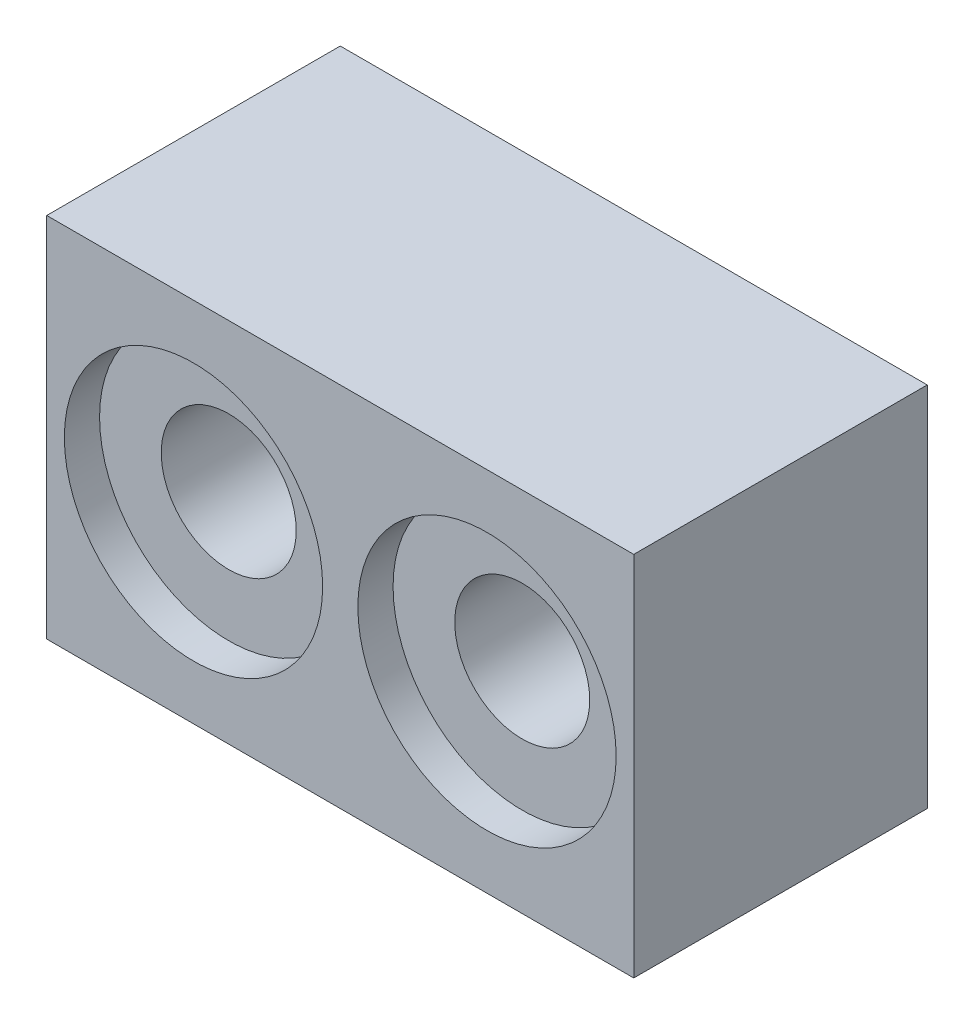
ISO-10303-21;
HEADER;
FILE_DESCRIPTION(('STEP AP214'),'2;1');
FILE_NAME('part.step','',(''),(''),'','','');
FILE_SCHEMA(('AUTOMOTIVE_DESIGN { 1 0 10303 214 1 1 1 1 }'));
ENDSEC;
DATA;
#1=APPLICATION_CONTEXT('core data for automotive mechanical design processes');
#2=APPLICATION_PROTOCOL_DEFINITION('international standard','automotive_design',2000,#1);
#3=PRODUCT_CONTEXT('',#1,'mechanical');
#4=PRODUCT('Part','Part','',(#3));
#5=PRODUCT_RELATED_PRODUCT_CATEGORY('part','',(#4));
#6=PRODUCT_DEFINITION_FORMATION('','',#4);
#7=PRODUCT_DEFINITION_CONTEXT('part definition',#1,'design');
#8=PRODUCT_DEFINITION('design','',#6,#7);
#9=PRODUCT_DEFINITION_SHAPE('','',#8);
#10=(LENGTH_UNIT() NAMED_UNIT(*) SI_UNIT(.MILLI.,.METRE.));
#11=(NAMED_UNIT(*) PLANE_ANGLE_UNIT() SI_UNIT($,.RADIAN.));
#12=(NAMED_UNIT(*) SI_UNIT($,.STERADIAN.) SOLID_ANGLE_UNIT());
#13=UNCERTAINTY_MEASURE_WITH_UNIT(LENGTH_MEASURE(1.E-05),#10,'distance_accuracy_value','');
#14=(GEOMETRIC_REPRESENTATION_CONTEXT(3) GLOBAL_UNCERTAINTY_ASSIGNED_CONTEXT((#13)) GLOBAL_UNIT_ASSIGNED_CONTEXT((#10,
#11,#12)) REPRESENTATION_CONTEXT('',''));
#15=CARTESIAN_POINT('',(0.,0.,0.));
#16=DIRECTION('',(0.,0.,1.));
#17=DIRECTION('',(1.,0.,0.));
#18=AXIS2_PLACEMENT_3D('',#15,#16,#17);
#19=CARTESIAN_POINT('',(0.,0.,6.35));
#20=DIRECTION('',(1.,0.,0.));
#21=DIRECTION('',(0.,0.,-1.));
#22=AXIS2_PLACEMENT_3D('',#19,#20,#21);
#23=PLANE('',#22);
#24=DIRECTION('',(0.,-1.,0.));
#25=VECTOR('',#24,1.);
#26=CARTESIAN_POINT('',(0.,0.,0.));
#27=LINE('',#26,#25);
#28=CARTESIAN_POINT('',(0.,7.9375,0.));
#29=VERTEX_POINT('',#28);
#30=CARTESIAN_POINT('',(0.,0.,0.));
#31=VERTEX_POINT('',#30);
#32=EDGE_CURVE('E96',#29,#31,#27,.T.);
#33=ORIENTED_EDGE('',*,*,#32,.T.);
#34=DIRECTION('',(0.,0.,-1.));
#35=VECTOR('',#34,1.);
#36=CARTESIAN_POINT('',(0.,0.,6.35));
#37=LINE('',#36,#35);
#38=CARTESIAN_POINT('',(0.,0.,6.35));
#39=VERTEX_POINT('',#38);
#40=EDGE_CURVE('E11',#39,#31,#37,.T.);
#41=ORIENTED_EDGE('',*,*,#40,.F.);
#42=DIRECTION('',(0.,-1.,0.));
#43=VECTOR('',#42,1.);
#44=CARTESIAN_POINT('',(0.,0.,6.35));
#45=LINE('',#44,#43);
#46=CARTESIAN_POINT('',(0.,7.9375,6.35));
#47=VERTEX_POINT('',#46);
#48=EDGE_CURVE('E84',#47,#39,#45,.T.);
#49=ORIENTED_EDGE('',*,*,#48,.F.);
#50=DIRECTION('',(0.,0.,-1.));
#51=VECTOR('',#50,1.);
#52=CARTESIAN_POINT('',(0.,7.9375,6.35));
#53=LINE('',#52,#51);
#54=EDGE_CURVE('E92',#47,#29,#53,.T.);
#55=ORIENTED_EDGE('',*,*,#54,.T.);
#56=EDGE_LOOP('',(#33,#41,#49,#55));
#57=FACE_BOUND('',#56,.T.);
#58=ADVANCED_FACE('F33',(#57),#23,.F.);
#59=CARTESIAN_POINT('',(0.,0.,6.35));
#60=DIRECTION('',(0.,1.,0.));
#61=DIRECTION('',(0.,0.,1.));
#62=AXIS2_PLACEMENT_3D('',#59,#60,#61);
#63=PLANE('',#62);
#64=DIRECTION('',(1.,0.,0.));
#65=VECTOR('',#64,1.);
#66=CARTESIAN_POINT('',(0.,0.,0.));
#67=LINE('',#66,#65);
#68=CARTESIAN_POINT('',(12.7,0.,0.));
#69=VERTEX_POINT('',#68);
#70=EDGE_CURVE('E88',#31,#69,#67,.T.);
#71=ORIENTED_EDGE('',*,*,#70,.T.);
#72=DIRECTION('',(0.,0.,-1.));
#73=VECTOR('',#72,1.);
#74=CARTESIAN_POINT('',(12.7,0.,6.35));
#75=LINE('',#74,#73);
#76=CARTESIAN_POINT('',(12.7,0.,6.35));
#77=VERTEX_POINT('',#76);
#78=EDGE_CURVE('E41',#77,#69,#75,.T.);
#79=ORIENTED_EDGE('',*,*,#78,.F.);
#80=DIRECTION('',(1.,0.,0.));
#81=VECTOR('',#80,1.);
#82=CARTESIAN_POINT('',(0.,0.,6.35));
#83=LINE('',#82,#81);
#84=EDGE_CURVE('E79',#39,#77,#83,.T.);
#85=ORIENTED_EDGE('',*,*,#84,.F.);
#86=ORIENTED_EDGE('',*,*,#40,.T.);
#87=EDGE_LOOP('',(#71,#79,#85,#86));
#88=FACE_BOUND('',#87,.T.);
#89=ADVANCED_FACE('F87',(#88),#63,.F.);
#90=CARTESIAN_POINT('',(12.7,0.,6.35));
#91=DIRECTION('',(-1.,0.,0.));
#92=DIRECTION('',(0.,0.,1.));
#93=AXIS2_PLACEMENT_3D('',#90,#91,#92);
#94=PLANE('',#93);
#95=DIRECTION('',(0.,1.,0.));
#96=VECTOR('',#95,1.);
#97=CARTESIAN_POINT('',(12.7,0.,0.));
#98=LINE('',#97,#96);
#99=CARTESIAN_POINT('',(12.7,7.9375,0.));
#100=VERTEX_POINT('',#99);
#101=EDGE_CURVE('E66',#69,#100,#98,.T.);
#102=ORIENTED_EDGE('',*,*,#101,.T.);
#103=DIRECTION('',(0.,0.,-1.));
#104=VECTOR('',#103,1.);
#105=CARTESIAN_POINT('',(12.7,7.9375,6.35));
#106=LINE('',#105,#104);
#107=CARTESIAN_POINT('',(12.7,7.9375,6.35));
#108=VERTEX_POINT('',#107);
#109=EDGE_CURVE('E89',#108,#100,#106,.T.);
#110=ORIENTED_EDGE('',*,*,#109,.F.);
#111=DIRECTION('',(0.,1.,0.));
#112=VECTOR('',#111,1.);
#113=CARTESIAN_POINT('',(12.7,0.,6.35));
#114=LINE('',#113,#112);
#115=EDGE_CURVE('E82',#77,#108,#114,.T.);
#116=ORIENTED_EDGE('',*,*,#115,.F.);
#117=ORIENTED_EDGE('',*,*,#78,.T.);
#118=EDGE_LOOP('',(#102,#110,#116,#117));
#119=FACE_BOUND('',#118,.T.);
#120=ADVANCED_FACE('F90',(#119),#94,.F.);
#121=CARTESIAN_POINT('',(0.,7.9375,6.35));
#122=DIRECTION('',(0.,-1.,0.));
#123=DIRECTION('',(0.,0.,-1.));
#124=AXIS2_PLACEMENT_3D('',#121,#122,#123);
#125=PLANE('',#124);
#126=DIRECTION('',(-1.,0.,0.));
#127=VECTOR('',#126,1.);
#128=CARTESIAN_POINT('',(0.,7.9375,0.));
#129=LINE('',#128,#127);
#130=EDGE_CURVE('E72',#100,#29,#129,.T.);
#131=ORIENTED_EDGE('',*,*,#130,.T.);
#132=ORIENTED_EDGE('',*,*,#54,.F.);
#133=DIRECTION('',(-1.,0.,0.));
#134=VECTOR('',#133,1.);
#135=CARTESIAN_POINT('',(0.,7.9375,6.35));
#136=LINE('',#135,#134);
#137=EDGE_CURVE('E49',#108,#47,#136,.T.);
#138=ORIENTED_EDGE('',*,*,#137,.F.);
#139=ORIENTED_EDGE('',*,*,#109,.T.);
#140=EDGE_LOOP('',(#131,#132,#138,#139));
#141=FACE_BOUND('',#140,.T.);
#142=ADVANCED_FACE('F104',(#141),#125,.F.);
#143=CARTESIAN_POINT('',(0.,0.,6.35));
#144=DIRECTION('',(0.,0.,-1.));
#145=DIRECTION('',(-1.,0.,0.));
#146=AXIS2_PLACEMENT_3D('',#143,#144,#145);
#147=PLANE('',#146);
#148=CARTESIAN_POINT('',(9.525,3.96875,6.35));
#149=DIRECTION('',(0.,0.,1.));
#150=DIRECTION('',(1.,0.,0.));
#151=AXIS2_PLACEMENT_3D('',#148,#149,#150);
#152=CIRCLE('',#151,2.794);
#153=CARTESIAN_POINT('',(12.319,3.96875,6.35));
#154=VERTEX_POINT('',#153);
#155=EDGE_CURVE('E116',#154,#154,#152,.T.);
#156=ORIENTED_EDGE('',*,*,#155,.F.);
#157=EDGE_LOOP('',(#156));
#158=FACE_BOUND('',#157,.T.);
#159=CARTESIAN_POINT('',(3.175,3.96875,6.35));
#160=DIRECTION('',(0.,0.,1.));
#161=DIRECTION('',(1.,0.,0.));
#162=AXIS2_PLACEMENT_3D('',#159,#160,#161);
#163=CIRCLE('',#162,2.794);
#164=CARTESIAN_POINT('',(5.969,3.96875,6.35));
#165=VERTEX_POINT('',#164);
#166=EDGE_CURVE('E110',#165,#165,#163,.T.);
#167=ORIENTED_EDGE('',*,*,#166,.F.);
#168=EDGE_LOOP('',(#167));
#169=FACE_BOUND('',#168,.T.);
#170=ORIENTED_EDGE('',*,*,#48,.T.);
#171=ORIENTED_EDGE('',*,*,#84,.T.);
#172=ORIENTED_EDGE('',*,*,#115,.T.);
#173=ORIENTED_EDGE('',*,*,#137,.T.);
#174=EDGE_LOOP('',(#170,#171,#172,#173));
#175=FACE_BOUND('',#174,.T.);
#176=ADVANCED_FACE('F80',(#158,#169,#175),#147,.F.);
#177=CARTESIAN_POINT('',(0.,0.,0.));
#178=DIRECTION('',(0.,0.,-1.));
#179=DIRECTION('',(-1.,0.,0.));
#180=AXIS2_PLACEMENT_3D('',#177,#178,#179);
#181=PLANE('',#180);
#182=CARTESIAN_POINT('',(9.525,3.96875,0.));
#183=DIRECTION('',(0.,0.,1.));
#184=DIRECTION('',(1.,0.,0.));
#185=AXIS2_PLACEMENT_3D('',#182,#183,#184);
#186=CIRCLE('',#185,1.4605);
#187=CARTESIAN_POINT('',(10.9855,3.96875,0.));
#188=VERTEX_POINT('',#187);
#189=EDGE_CURVE('E125',#188,#188,#186,.T.);
#190=ORIENTED_EDGE('',*,*,#189,.T.);
#191=EDGE_LOOP('',(#190));
#192=FACE_BOUND('',#191,.T.);
#193=CARTESIAN_POINT('',(3.175,3.96875,0.));
#194=DIRECTION('',(0.,0.,1.));
#195=DIRECTION('',(1.,0.,0.));
#196=AXIS2_PLACEMENT_3D('',#193,#194,#195);
#197=CIRCLE('',#196,1.4605);
#198=CARTESIAN_POINT('',(4.6355,3.96875,0.));
#199=VERTEX_POINT('',#198);
#200=EDGE_CURVE('E119',#199,#199,#197,.T.);
#201=ORIENTED_EDGE('',*,*,#200,.T.);
#202=EDGE_LOOP('',(#201));
#203=FACE_BOUND('',#202,.T.);
#204=ORIENTED_EDGE('',*,*,#32,.F.);
#205=ORIENTED_EDGE('',*,*,#130,.F.);
#206=ORIENTED_EDGE('',*,*,#101,.F.);
#207=ORIENTED_EDGE('',*,*,#70,.F.);
#208=EDGE_LOOP('',(#204,#205,#206,#207));
#209=FACE_BOUND('',#208,.T.);
#210=ADVANCED_FACE('F107',(#192,#203,#209),#181,.T.);
#211=CARTESIAN_POINT('',(3.175,3.96875,5.588));
#212=DIRECTION('',(0.,0.,1.));
#213=DIRECTION('',(1.,0.,0.));
#214=AXIS2_PLACEMENT_3D('',#211,#212,#213);
#215=CYLINDRICAL_SURFACE('',#214,2.794);
#216=CARTESIAN_POINT('',(3.175,3.96875,5.588));
#217=DIRECTION('',(0.,0.,1.));
#218=DIRECTION('',(1.,0.,0.));
#219=AXIS2_PLACEMENT_3D('',#216,#217,#218);
#220=CIRCLE('',#219,2.794);
#221=CARTESIAN_POINT('',(5.969,3.96875,5.588));
#222=VERTEX_POINT('',#221);
#223=EDGE_CURVE('E99',#222,#222,#220,.T.);
#224=CARTESIAN_POINT('',(5.969,3.96875,5.588));
#225=CARTESIAN_POINT('',(5.969,3.96875,5.5959375));
#226=CARTESIAN_POINT('',(5.969,3.96875,5.603875));
#227=CARTESIAN_POINT('',(5.969,3.96875,5.61975));
#228=CARTESIAN_POINT('',(5.969,3.96875,5.6276875));
#229=CARTESIAN_POINT('',(5.969,3.96875,5.6435625));
#230=CARTESIAN_POINT('',(5.969,3.96875,5.6515));
#231=CARTESIAN_POINT('',(5.969,3.96875,5.667375));
#232=CARTESIAN_POINT('',(5.969,3.96875,5.6753125));
#233=CARTESIAN_POINT('',(5.969,3.96875,5.6911875));
#234=CARTESIAN_POINT('',(5.969,3.96875,5.699125));
#235=CARTESIAN_POINT('',(5.969,3.96875,5.715));
#236=CARTESIAN_POINT('',(5.969,3.96875,5.7229375));
#237=CARTESIAN_POINT('',(5.969,3.96875,5.7388125));
#238=CARTESIAN_POINT('',(5.969,3.96875,5.74675));
#239=CARTESIAN_POINT('',(5.969,3.96875,5.762625));
#240=CARTESIAN_POINT('',(5.969,3.96875,5.7705625));
#241=CARTESIAN_POINT('',(5.969,3.96875,5.7864375));
#242=CARTESIAN_POINT('',(5.969,3.96875,5.794375));
#243=CARTESIAN_POINT('',(5.969,3.96875,5.81025));
#244=CARTESIAN_POINT('',(5.969,3.96875,5.8181875));
#245=CARTESIAN_POINT('',(5.969,3.96875,5.8340625));
#246=CARTESIAN_POINT('',(5.969,3.96875,5.842));
#247=CARTESIAN_POINT('',(5.969,3.96875,5.857875));
#248=CARTESIAN_POINT('',(5.969,3.96875,5.8658125));
#249=CARTESIAN_POINT('',(5.969,3.96875,5.8816875));
#250=CARTESIAN_POINT('',(5.969,3.96875,5.889625));
#251=CARTESIAN_POINT('',(5.969,3.96875,5.9055));
#252=CARTESIAN_POINT('',(5.969,3.96875,5.9134375));
#253=CARTESIAN_POINT('',(5.969,3.96875,5.9293125));
#254=CARTESIAN_POINT('',(5.969,3.96875,5.93725));
#255=CARTESIAN_POINT('',(5.969,3.96875,5.953125));
#256=CARTESIAN_POINT('',(5.969,3.96875,5.9610625));
#257=CARTESIAN_POINT('',(5.969,3.96875,5.9769375));
#258=CARTESIAN_POINT('',(5.969,3.96875,5.984875));
#259=CARTESIAN_POINT('',(5.969,3.96875,6.00075));
#260=CARTESIAN_POINT('',(5.969,3.96875,6.0086875));
#261=CARTESIAN_POINT('',(5.969,3.96875,6.0245625));
#262=CARTESIAN_POINT('',(5.969,3.96875,6.0325));
#263=CARTESIAN_POINT('',(5.969,3.96875,6.048375));
#264=CARTESIAN_POINT('',(5.969,3.96875,6.0563125));
#265=CARTESIAN_POINT('',(5.969,3.96875,6.0721875));
#266=CARTESIAN_POINT('',(5.969,3.96875,6.080125));
#267=CARTESIAN_POINT('',(5.969,3.96875,6.096));
#268=CARTESIAN_POINT('',(5.969,3.96875,6.1039375));
#269=CARTESIAN_POINT('',(5.969,3.96875,6.1198125));
#270=CARTESIAN_POINT('',(5.969,3.96875,6.12775));
#271=CARTESIAN_POINT('',(5.969,3.96875,6.143625));
#272=CARTESIAN_POINT('',(5.969,3.96875,6.1515625));
#273=CARTESIAN_POINT('',(5.969,3.96875,6.1674375));
#274=CARTESIAN_POINT('',(5.969,3.96875,6.175375));
#275=CARTESIAN_POINT('',(5.969,3.96875,6.19125));
#276=CARTESIAN_POINT('',(5.969,3.96875,6.1991875));
#277=CARTESIAN_POINT('',(5.969,3.96875,6.2150625));
#278=CARTESIAN_POINT('',(5.969,3.96875,6.223));
#279=CARTESIAN_POINT('',(5.969,3.96875,6.238875));
#280=CARTESIAN_POINT('',(5.969,3.96875,6.2468125));
#281=CARTESIAN_POINT('',(5.969,3.96875,6.2626875));
#282=CARTESIAN_POINT('',(5.969,3.96875,6.270625));
#283=CARTESIAN_POINT('',(5.969,3.96875,6.2865));
#284=CARTESIAN_POINT('',(5.969,3.96875,6.2944375));
#285=CARTESIAN_POINT('',(5.969,3.96875,6.3103125));
#286=CARTESIAN_POINT('',(5.969,3.96875,6.31825));
#287=CARTESIAN_POINT('',(5.969,3.96875,6.334125));
#288=CARTESIAN_POINT('',(5.969,3.96875,6.3420625));
#289=CARTESIAN_POINT('',(5.969,3.96875,6.35));
#290=B_SPLINE_CURVE_WITH_KNOTS('',3,(#224,#225,#226,#227,#228,#229,#230,#231,#232,#233,#234,
#235,#236,#237,#238,#239,#240,#241,#242,#243,#244,#245,#246,#247,#248,#249,#250,#251,#252,#253,
#254,#255,#256,#257,#258,#259,#260,#261,#262,#263,#264,#265,#266,#267,#268,#269,#270,#271,#272,
#273,#274,#275,#276,#277,#278,#279,#280,#281,#282,#283,#284,#285,#286,#287,#288,#289),
.UNSPECIFIED.,.F.,.F.,(4,2,2,2,2,2,2,2,2,2,2,2,2,2,2,2,2,2,2,2,2,2,2,2,2,2,2,2,2,2,2,2,4),(0.,
0.0238124999999995,0.0476249999999999,0.0714374999999995,0.0952499999999998,0.119062499999999,
0.142875,0.166687499999999,0.1905,0.214312499999999,0.238125,0.261937499999999,0.28575,
0.309562499999999,0.333374999999999,0.357187499999999,0.380999999999999,0.404812499999999,
0.428624999999999,0.4524375,0.476249999999999,0.5000625,0.523874999999999,0.5476875,
0.571499999999999,0.595312499999999,0.619124999999999,0.642937499999999,0.666749999999999,
0.690562499999999,0.714374999999999,0.738187499999999,0.761999999999999),.UNSPECIFIED.);
#291=EDGE_CURVE('BSEAM161',#222,#165,#290,.T.);
#292=ORIENTED_EDGE('',*,*,#223,.F.);
#293=ORIENTED_EDGE('',*,*,#166,.T.);
#294=ORIENTED_EDGE('',*,*,#291,.T.);
#295=ORIENTED_EDGE('',*,*,#291,.F.);
#296=EDGE_LOOP('',(#292,#294,#293,#295));
#297=FACE_BOUND('',#296,.T.);
#298=ADVANCED_FACE('F161',(#297),#215,.F.);
#299=CARTESIAN_POINT('',(3.175,3.96875,5.588));
#300=DIRECTION('',(0.,0.,1.));
#301=DIRECTION('',(1.,0.,0.));
#302=AXIS2_PLACEMENT_3D('',#299,#300,#301);
#303=PLANE('',#302);
#304=CARTESIAN_POINT('',(3.175,3.96875,5.588));
#305=DIRECTION('',(0.,0.,1.));
#306=DIRECTION('',(1.,0.,0.));
#307=AXIS2_PLACEMENT_3D('',#304,#305,#306);
#308=CIRCLE('',#307,1.4605);
#309=CARTESIAN_POINT('',(4.6355,3.96875,5.588));
#310=VERTEX_POINT('',#309);
#311=EDGE_CURVE('E122',#310,#310,#308,.T.);
#312=ORIENTED_EDGE('',*,*,#311,.F.);
#313=EDGE_LOOP('',(#312));
#314=FACE_BOUND('',#313,.T.);
#315=ORIENTED_EDGE('',*,*,#223,.T.);
#316=EDGE_LOOP('',(#315));
#317=FACE_BOUND('',#316,.T.);
#318=ADVANCED_FACE('F152',(#314,#317),#303,.T.);
#319=CARTESIAN_POINT('',(9.525,3.96875,5.588));
#320=DIRECTION('',(0.,0.,1.));
#321=DIRECTION('',(1.,0.,0.));
#322=AXIS2_PLACEMENT_3D('',#319,#320,#321);
#323=CYLINDRICAL_SURFACE('',#322,2.794);
#324=CARTESIAN_POINT('',(9.525,3.96875,5.588));
#325=DIRECTION('',(0.,0.,1.));
#326=DIRECTION('',(1.,0.,0.));
#327=AXIS2_PLACEMENT_3D('',#324,#325,#326);
#328=CIRCLE('',#327,2.794);
#329=CARTESIAN_POINT('',(12.319,3.96875,5.588));
#330=VERTEX_POINT('',#329);
#331=EDGE_CURVE('E113',#330,#330,#328,.T.);
#332=CARTESIAN_POINT('',(12.319,3.96875,5.588));
#333=CARTESIAN_POINT('',(12.319,3.96875,5.5959375));
#334=CARTESIAN_POINT('',(12.319,3.96875,5.603875));
#335=CARTESIAN_POINT('',(12.319,3.96875,5.61975));
#336=CARTESIAN_POINT('',(12.319,3.96875,5.6276875));
#337=CARTESIAN_POINT('',(12.319,3.96875,5.6435625));
#338=CARTESIAN_POINT('',(12.319,3.96875,5.6515));
#339=CARTESIAN_POINT('',(12.319,3.96875,5.667375));
#340=CARTESIAN_POINT('',(12.319,3.96875,5.6753125));
#341=CARTESIAN_POINT('',(12.319,3.96875,5.6911875));
#342=CARTESIAN_POINT('',(12.319,3.96875,5.699125));
#343=CARTESIAN_POINT('',(12.319,3.96875,5.715));
#344=CARTESIAN_POINT('',(12.319,3.96875,5.7229375));
#345=CARTESIAN_POINT('',(12.319,3.96875,5.7388125));
#346=CARTESIAN_POINT('',(12.319,3.96875,5.74675));
#347=CARTESIAN_POINT('',(12.319,3.96875,5.762625));
#348=CARTESIAN_POINT('',(12.319,3.96875,5.7705625));
#349=CARTESIAN_POINT('',(12.319,3.96875,5.7864375));
#350=CARTESIAN_POINT('',(12.319,3.96875,5.794375));
#351=CARTESIAN_POINT('',(12.319,3.96875,5.81025));
#352=CARTESIAN_POINT('',(12.319,3.96875,5.8181875));
#353=CARTESIAN_POINT('',(12.319,3.96875,5.8340625));
#354=CARTESIAN_POINT('',(12.319,3.96875,5.842));
#355=CARTESIAN_POINT('',(12.319,3.96875,5.857875));
#356=CARTESIAN_POINT('',(12.319,3.96875,5.8658125));
#357=CARTESIAN_POINT('',(12.319,3.96875,5.8816875));
#358=CARTESIAN_POINT('',(12.319,3.96875,5.889625));
#359=CARTESIAN_POINT('',(12.319,3.96875,5.9055));
#360=CARTESIAN_POINT('',(12.319,3.96875,5.9134375));
#361=CARTESIAN_POINT('',(12.319,3.96875,5.9293125));
#362=CARTESIAN_POINT('',(12.319,3.96875,5.93725));
#363=CARTESIAN_POINT('',(12.319,3.96875,5.953125));
#364=CARTESIAN_POINT('',(12.319,3.96875,5.9610625));
#365=CARTESIAN_POINT('',(12.319,3.96875,5.9769375));
#366=CARTESIAN_POINT('',(12.319,3.96875,5.984875));
#367=CARTESIAN_POINT('',(12.319,3.96875,6.00075));
#368=CARTESIAN_POINT('',(12.319,3.96875,6.0086875));
#369=CARTESIAN_POINT('',(12.319,3.96875,6.0245625));
#370=CARTESIAN_POINT('',(12.319,3.96875,6.0325));
#371=CARTESIAN_POINT('',(12.319,3.96875,6.048375));
#372=CARTESIAN_POINT('',(12.319,3.96875,6.0563125));
#373=CARTESIAN_POINT('',(12.319,3.96875,6.0721875));
#374=CARTESIAN_POINT('',(12.319,3.96875,6.080125));
#375=CARTESIAN_POINT('',(12.319,3.96875,6.096));
#376=CARTESIAN_POINT('',(12.319,3.96875,6.1039375));
#377=CARTESIAN_POINT('',(12.319,3.96875,6.1198125));
#378=CARTESIAN_POINT('',(12.319,3.96875,6.12775));
#379=CARTESIAN_POINT('',(12.319,3.96875,6.143625));
#380=CARTESIAN_POINT('',(12.319,3.96875,6.1515625));
#381=CARTESIAN_POINT('',(12.319,3.96875,6.1674375));
#382=CARTESIAN_POINT('',(12.319,3.96875,6.175375));
#383=CARTESIAN_POINT('',(12.319,3.96875,6.19125));
#384=CARTESIAN_POINT('',(12.319,3.96875,6.1991875));
#385=CARTESIAN_POINT('',(12.319,3.96875,6.2150625));
#386=CARTESIAN_POINT('',(12.319,3.96875,6.223));
#387=CARTESIAN_POINT('',(12.319,3.96875,6.238875));
#388=CARTESIAN_POINT('',(12.319,3.96875,6.2468125));
#389=CARTESIAN_POINT('',(12.319,3.96875,6.2626875));
#390=CARTESIAN_POINT('',(12.319,3.96875,6.270625));
#391=CARTESIAN_POINT('',(12.319,3.96875,6.2865));
#392=CARTESIAN_POINT('',(12.319,3.96875,6.2944375));
#393=CARTESIAN_POINT('',(12.319,3.96875,6.3103125));
#394=CARTESIAN_POINT('',(12.319,3.96875,6.31825));
#395=CARTESIAN_POINT('',(12.319,3.96875,6.334125));
#396=CARTESIAN_POINT('',(12.319,3.96875,6.3420625));
#397=CARTESIAN_POINT('',(12.319,3.96875,6.35));
#398=B_SPLINE_CURVE_WITH_KNOTS('',3,(#332,#333,#334,#335,#336,#337,#338,#339,#340,#341,#342,
#343,#344,#345,#346,#347,#348,#349,#350,#351,#352,#353,#354,#355,#356,#357,#358,#359,#360,#361,
#362,#363,#364,#365,#366,#367,#368,#369,#370,#371,#372,#373,#374,#375,#376,#377,#378,#379,#380,
#381,#382,#383,#384,#385,#386,#387,#388,#389,#390,#391,#392,#393,#394,#395,#396,#397),
.UNSPECIFIED.,.F.,.F.,(4,2,2,2,2,2,2,2,2,2,2,2,2,2,2,2,2,2,2,2,2,2,2,2,2,2,2,2,2,2,2,2,4),(0.,
0.0238124999999995,0.0476249999999999,0.0714374999999995,0.0952499999999998,0.119062499999999,
0.142875,0.166687499999999,0.1905,0.214312499999999,0.238125,0.261937499999999,0.28575,
0.309562499999999,0.333374999999999,0.357187499999999,0.380999999999999,0.404812499999999,
0.428624999999999,0.4524375,0.476249999999999,0.5000625,0.523874999999999,0.5476875,
0.571499999999999,0.595312499999999,0.619124999999999,0.642937499999999,0.666749999999999,
0.690562499999999,0.714374999999999,0.738187499999999,0.761999999999999),.UNSPECIFIED.);
#399=EDGE_CURVE('BSEAM146',#330,#154,#398,.T.);
#400=ORIENTED_EDGE('',*,*,#331,.F.);
#401=ORIENTED_EDGE('',*,*,#155,.T.);
#402=ORIENTED_EDGE('',*,*,#399,.T.);
#403=ORIENTED_EDGE('',*,*,#399,.F.);
#404=EDGE_LOOP('',(#400,#402,#401,#403));
#405=FACE_BOUND('',#404,.T.);
#406=ADVANCED_FACE('F146',(#405),#323,.F.);
#407=CARTESIAN_POINT('',(9.525,3.96875,5.588));
#408=DIRECTION('',(0.,0.,1.));
#409=DIRECTION('',(1.,0.,0.));
#410=AXIS2_PLACEMENT_3D('',#407,#408,#409);
#411=PLANE('',#410);
#412=CARTESIAN_POINT('',(9.525,3.96875,5.588));
#413=DIRECTION('',(0.,0.,1.));
#414=DIRECTION('',(1.,0.,0.));
#415=AXIS2_PLACEMENT_3D('',#412,#413,#414);
#416=CIRCLE('',#415,1.4605);
#417=CARTESIAN_POINT('',(10.9855,3.96875,5.588));
#418=VERTEX_POINT('',#417);
#419=EDGE_CURVE('E128',#418,#418,#416,.T.);
#420=ORIENTED_EDGE('',*,*,#419,.F.);
#421=EDGE_LOOP('',(#420));
#422=FACE_BOUND('',#421,.T.);
#423=ORIENTED_EDGE('',*,*,#331,.T.);
#424=EDGE_LOOP('',(#423));
#425=FACE_BOUND('',#424,.T.);
#426=ADVANCED_FACE('F143',(#422,#425),#411,.T.);
#427=CARTESIAN_POINT('',(3.175,3.96875,0.));
#428=DIRECTION('',(0.,0.,1.));
#429=DIRECTION('',(1.,0.,0.));
#430=AXIS2_PLACEMENT_3D('',#427,#428,#429);
#431=CYLINDRICAL_SURFACE('',#430,1.4605);
#432=ORIENTED_EDGE('',*,*,#200,.F.);
#433=EDGE_LOOP('',(#432));
#434=FACE_BOUND('',#433,.T.);
#435=ORIENTED_EDGE('',*,*,#311,.T.);
#436=EDGE_LOOP('',(#435));
#437=FACE_BOUND('',#436,.T.);
#438=ADVANCED_FACE('F139',(#434,#437),#431,.F.);
#439=CARTESIAN_POINT('',(9.525,3.96875,0.));
#440=DIRECTION('',(0.,0.,1.));
#441=DIRECTION('',(1.,0.,0.));
#442=AXIS2_PLACEMENT_3D('',#439,#440,#441);
#443=CYLINDRICAL_SURFACE('',#442,1.4605);
#444=ORIENTED_EDGE('',*,*,#189,.F.);
#445=EDGE_LOOP('',(#444));
#446=FACE_BOUND('',#445,.T.);
#447=ORIENTED_EDGE('',*,*,#419,.T.);
#448=EDGE_LOOP('',(#447));
#449=FACE_BOUND('',#448,.T.);
#450=ADVANCED_FACE('F136',(#446,#449),#443,.F.);
#451=CLOSED_SHELL('',(#58,#89,#120,#142,#176,#210,#298,#318,#406,#426,#438,#450));
#452=MANIFOLD_SOLID_BREP('B2',#451);
#453=ADVANCED_BREP_SHAPE_REPRESENTATION('',(#18,#452),#14);
#454=SHAPE_DEFINITION_REPRESENTATION(#9,#453);
ENDSEC;
END-ISO-10303-21;
